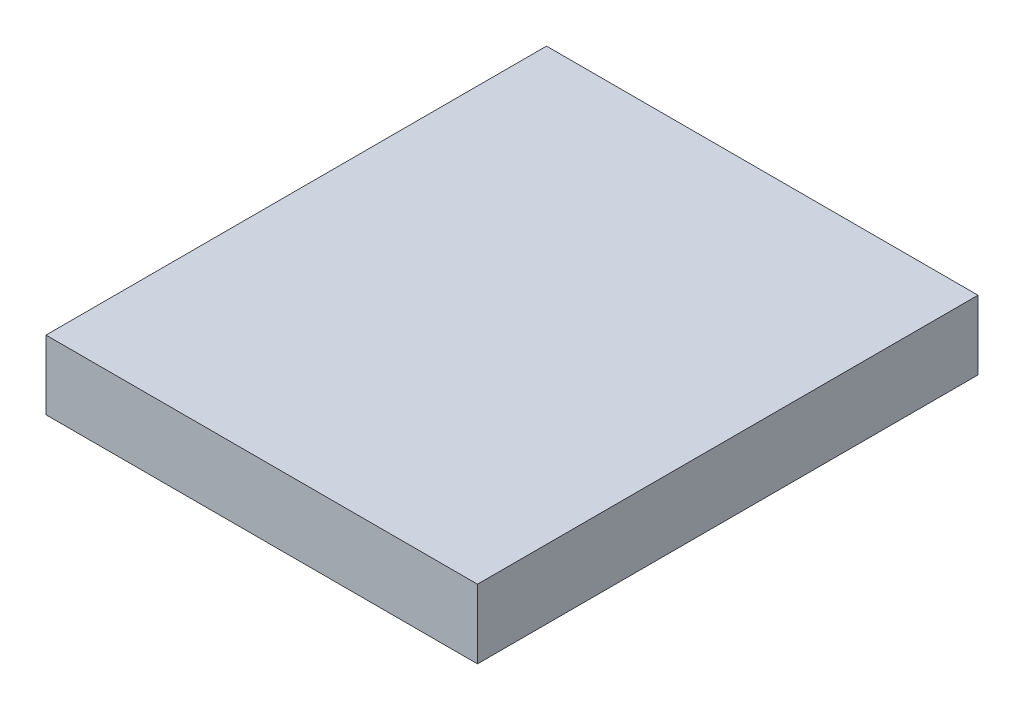
ISO-10303-21;
HEADER;
FILE_DESCRIPTION(('STEP AP214'),'2;1');
FILE_NAME('part.step','',(''),(''),'','','');
FILE_SCHEMA(('AUTOMOTIVE_DESIGN { 1 0 10303 214 1 1 1 1 }'));
ENDSEC;
DATA;
#1=APPLICATION_CONTEXT('core data for automotive mechanical design processes');
#2=APPLICATION_PROTOCOL_DEFINITION('international standard','automotive_design',2000,#1);
#3=PRODUCT_CONTEXT('',#1,'mechanical');
#4=PRODUCT('Part','Part','',(#3));
#5=PRODUCT_RELATED_PRODUCT_CATEGORY('part','',(#4));
#6=PRODUCT_DEFINITION_FORMATION('','',#4);
#7=PRODUCT_DEFINITION_CONTEXT('part definition',#1,'design');
#8=PRODUCT_DEFINITION('design','',#6,#7);
#9=PRODUCT_DEFINITION_SHAPE('','',#8);
#10=(LENGTH_UNIT() NAMED_UNIT(*) SI_UNIT(.MILLI.,.METRE.));
#11=(NAMED_UNIT(*) PLANE_ANGLE_UNIT() SI_UNIT($,.RADIAN.));
#12=(NAMED_UNIT(*) SI_UNIT($,.STERADIAN.) SOLID_ANGLE_UNIT());
#13=UNCERTAINTY_MEASURE_WITH_UNIT(LENGTH_MEASURE(1.E-05),#10,'distance_accuracy_value','');
#14=(GEOMETRIC_REPRESENTATION_CONTEXT(3) GLOBAL_UNCERTAINTY_ASSIGNED_CONTEXT((#13)) GLOBAL_UNIT_ASSIGNED_CONTEXT((#10,
#11,#12)) REPRESENTATION_CONTEXT('',''));
#15=CARTESIAN_POINT('',(0.,0.,0.));
#16=DIRECTION('',(0.,0.,1.));
#17=DIRECTION('',(1.,0.,0.));
#18=AXIS2_PLACEMENT_3D('',#15,#16,#17);
#19=CARTESIAN_POINT('',(0.,-22.86,0.));
#20=DIRECTION('',(0.,-1.,0.));
#21=DIRECTION('',(0.,0.,-1.));
#22=AXIS2_PLACEMENT_3D('',#19,#20,#21);
#23=PLANE('',#22);
#24=DIRECTION('',(0.,0.,-1.));
#25=VECTOR('',#24,1.);
#26=CARTESIAN_POINT('',(79.375,-22.86,-92.075));
#27=LINE('',#26,#25);
#28=CARTESIAN_POINT('',(79.375,-22.86,92.075));
#29=VERTEX_POINT('',#28);
#30=CARTESIAN_POINT('',(79.375,-22.86,-92.075));
#31=VERTEX_POINT('',#30);
#32=EDGE_CURVE('E147',#29,#31,#27,.T.);
#33=ORIENTED_EDGE('',*,*,#32,.F.);
#34=DIRECTION('',(1.,0.,0.));
#35=VECTOR('',#34,1.);
#36=CARTESIAN_POINT('',(79.375,-22.86,92.075));
#37=LINE('',#36,#35);
#38=CARTESIAN_POINT('',(-79.375,-22.86,92.075));
#39=VERTEX_POINT('',#38);
#40=EDGE_CURVE('E155',#39,#29,#37,.T.);
#41=ORIENTED_EDGE('',*,*,#40,.F.);
#42=DIRECTION('',(0.,0.,1.));
#43=VECTOR('',#42,1.);
#44=CARTESIAN_POINT('',(-79.375,-22.86,-92.075));
#45=LINE('',#44,#43);
#46=CARTESIAN_POINT('',(-79.375,-22.86,-92.075));
#47=VERTEX_POINT('',#46);
#48=EDGE_CURVE('E152',#47,#39,#45,.T.);
#49=ORIENTED_EDGE('',*,*,#48,.F.);
#50=DIRECTION('',(-1.,0.,0.));
#51=VECTOR('',#50,1.);
#52=CARTESIAN_POINT('',(79.375,-22.86,-92.075));
#53=LINE('',#52,#51);
#54=EDGE_CURVE('E149',#31,#47,#53,.T.);
#55=ORIENTED_EDGE('',*,*,#54,.F.);
#56=EDGE_LOOP('',(#33,#41,#49,#55));
#57=FACE_BOUND('',#56,.T.);
#58=DIRECTION('',(1.,0.,0.));
#59=VECTOR('',#58,1.);
#60=CARTESIAN_POINT('',(79.375,-22.86,89.535));
#61=LINE('',#60,#59);
#62=CARTESIAN_POINT('',(-76.835,-22.86,89.535));
#63=VERTEX_POINT('',#62);
#64=CARTESIAN_POINT('',(76.835,-22.86,89.535));
#65=VERTEX_POINT('',#64);
#66=EDGE_CURVE('E142',#63,#65,#61,.T.);
#67=ORIENTED_EDGE('',*,*,#66,.T.);
#68=DIRECTION('',(0.,0.,-1.));
#69=VECTOR('',#68,1.);
#70=CARTESIAN_POINT('',(76.835,-22.86,-92.075));
#71=LINE('',#70,#69);
#72=CARTESIAN_POINT('',(76.835,-22.86,-89.535));
#73=VERTEX_POINT('',#72);
#74=EDGE_CURVE('E111',#65,#73,#71,.T.);
#75=ORIENTED_EDGE('',*,*,#74,.T.);
#76=DIRECTION('',(-1.,0.,0.));
#77=VECTOR('',#76,1.);
#78=CARTESIAN_POINT('',(79.375,-22.86,-89.535));
#79=LINE('',#78,#77);
#80=CARTESIAN_POINT('',(-76.835,-22.86,-89.535));
#81=VERTEX_POINT('',#80);
#82=EDGE_CURVE('E132',#73,#81,#79,.T.);
#83=ORIENTED_EDGE('',*,*,#82,.T.);
#84=DIRECTION('',(0.,0.,1.));
#85=VECTOR('',#84,1.);
#86=CARTESIAN_POINT('',(-76.835,-22.86,-92.075));
#87=LINE('',#86,#85);
#88=EDGE_CURVE('E50',#81,#63,#87,.T.);
#89=ORIENTED_EDGE('',*,*,#88,.T.);
#90=EDGE_LOOP('',(#67,#75,#83,#89));
#91=FACE_BOUND('',#90,.T.);
#92=ADVANCED_FACE('F33',(#57,#91),#23,.T.);
#93=CARTESIAN_POINT('',(79.375,-22.86,-92.075));
#94=DIRECTION('',(1.,0.,0.));
#95=DIRECTION('',(0.,0.,-1.));
#96=AXIS2_PLACEMENT_3D('',#93,#94,#95);
#97=PLANE('',#96);
#98=DIRECTION('',(0.,0.,-1.));
#99=VECTOR('',#98,1.);
#100=CARTESIAN_POINT('',(79.375,2.54,-92.075));
#101=LINE('',#100,#99);
#102=CARTESIAN_POINT('',(79.375,2.54,92.075));
#103=VERTEX_POINT('',#102);
#104=CARTESIAN_POINT('',(79.375,2.54,-92.075));
#105=VERTEX_POINT('',#104);
#106=EDGE_CURVE('E116',#103,#105,#101,.T.);
#107=ORIENTED_EDGE('',*,*,#106,.F.);
#108=DIRECTION('',(0.,1.,0.));
#109=VECTOR('',#108,1.);
#110=CARTESIAN_POINT('',(79.375,-22.86,92.075));
#111=LINE('',#110,#109);
#112=EDGE_CURVE('E11',#29,#103,#111,.T.);
#113=ORIENTED_EDGE('',*,*,#112,.F.);
#114=ORIENTED_EDGE('',*,*,#32,.T.);
#115=DIRECTION('',(0.,1.,0.));
#116=VECTOR('',#115,1.);
#117=CARTESIAN_POINT('',(79.375,-22.86,-92.075));
#118=LINE('',#117,#116);
#119=EDGE_CURVE('E37',#31,#105,#118,.T.);
#120=ORIENTED_EDGE('',*,*,#119,.T.);
#121=EDGE_LOOP('',(#107,#113,#114,#120));
#122=FACE_BOUND('',#121,.T.);
#123=ADVANCED_FACE('F35',(#122),#97,.T.);
#124=CARTESIAN_POINT('',(79.375,-22.86,92.075));
#125=DIRECTION('',(0.,0.,1.));
#126=DIRECTION('',(1.,0.,0.));
#127=AXIS2_PLACEMENT_3D('',#124,#125,#126);
#128=PLANE('',#127);
#129=DIRECTION('',(1.,0.,0.));
#130=VECTOR('',#129,1.);
#131=CARTESIAN_POINT('',(79.375,2.54,92.075));
#132=LINE('',#131,#130);
#133=CARTESIAN_POINT('',(-79.375,2.54,92.075));
#134=VERTEX_POINT('',#133);
#135=EDGE_CURVE('E150',#134,#103,#132,.T.);
#136=ORIENTED_EDGE('',*,*,#135,.F.);
#137=DIRECTION('',(0.,1.,0.));
#138=VECTOR('',#137,1.);
#139=CARTESIAN_POINT('',(-79.375,-22.86,92.075));
#140=LINE('',#139,#138);
#141=EDGE_CURVE('E42',#39,#134,#140,.T.);
#142=ORIENTED_EDGE('',*,*,#141,.F.);
#143=ORIENTED_EDGE('',*,*,#40,.T.);
#144=ORIENTED_EDGE('',*,*,#112,.T.);
#145=EDGE_LOOP('',(#136,#142,#143,#144));
#146=FACE_BOUND('',#145,.T.);
#147=ADVANCED_FACE('F172',(#146),#128,.T.);
#148=CARTESIAN_POINT('',(-79.375,-22.86,-92.075));
#149=DIRECTION('',(-1.,0.,0.));
#150=DIRECTION('',(0.,0.,1.));
#151=AXIS2_PLACEMENT_3D('',#148,#149,#150);
#152=PLANE('',#151);
#153=DIRECTION('',(0.,0.,1.));
#154=VECTOR('',#153,1.);
#155=CARTESIAN_POINT('',(-79.375,2.54,-92.075));
#156=LINE('',#155,#154);
#157=CARTESIAN_POINT('',(-79.375,2.54,-92.075));
#158=VERTEX_POINT('',#157);
#159=EDGE_CURVE('E162',#158,#134,#156,.T.);
#160=ORIENTED_EDGE('',*,*,#159,.F.);
#161=DIRECTION('',(0.,1.,0.));
#162=VECTOR('',#161,1.);
#163=CARTESIAN_POINT('',(-79.375,-22.86,-92.075));
#164=LINE('',#163,#162);
#165=EDGE_CURVE('E167',#47,#158,#164,.T.);
#166=ORIENTED_EDGE('',*,*,#165,.F.);
#167=ORIENTED_EDGE('',*,*,#48,.T.);
#168=ORIENTED_EDGE('',*,*,#141,.T.);
#169=EDGE_LOOP('',(#160,#166,#167,#168));
#170=FACE_BOUND('',#169,.T.);
#171=ADVANCED_FACE('F176',(#170),#152,.T.);
#172=CARTESIAN_POINT('',(79.375,-22.86,-92.075));
#173=DIRECTION('',(0.,0.,-1.));
#174=DIRECTION('',(-1.,0.,0.));
#175=AXIS2_PLACEMENT_3D('',#172,#173,#174);
#176=PLANE('',#175);
#177=DIRECTION('',(-1.,0.,0.));
#178=VECTOR('',#177,1.);
#179=CARTESIAN_POINT('',(79.375,2.54,-92.075));
#180=LINE('',#179,#178);
#181=EDGE_CURVE('E159',#105,#158,#180,.T.);
#182=ORIENTED_EDGE('',*,*,#181,.F.);
#183=ORIENTED_EDGE('',*,*,#119,.F.);
#184=ORIENTED_EDGE('',*,*,#54,.T.);
#185=ORIENTED_EDGE('',*,*,#165,.T.);
#186=EDGE_LOOP('',(#182,#183,#184,#185));
#187=FACE_BOUND('',#186,.T.);
#188=ADVANCED_FACE('F169',(#187),#176,.T.);
#189=CARTESIAN_POINT('',(0.,2.54,0.));
#190=DIRECTION('',(0.,-1.,0.));
#191=DIRECTION('',(0.,0.,-1.));
#192=AXIS2_PLACEMENT_3D('',#189,#190,#191);
#193=PLANE('',#192);
#194=ORIENTED_EDGE('',*,*,#106,.T.);
#195=ORIENTED_EDGE('',*,*,#181,.T.);
#196=ORIENTED_EDGE('',*,*,#159,.T.);
#197=ORIENTED_EDGE('',*,*,#135,.T.);
#198=EDGE_LOOP('',(#194,#195,#196,#197));
#199=FACE_BOUND('',#198,.T.);
#200=ADVANCED_FACE('F171',(#199),#193,.F.);
#201=CARTESIAN_POINT('',(76.835,-22.86,-92.075));
#202=DIRECTION('',(1.,0.,0.));
#203=DIRECTION('',(0.,0.,-1.));
#204=AXIS2_PLACEMENT_3D('',#201,#202,#203);
#205=PLANE('',#204);
#206=DIRECTION('',(0.,0.,-1.));
#207=VECTOR('',#206,1.);
#208=CARTESIAN_POINT('',(76.835,0.,-92.075));
#209=LINE('',#208,#207);
#210=CARTESIAN_POINT('',(76.835,0.,89.535));
#211=VERTEX_POINT('',#210);
#212=CARTESIAN_POINT('',(76.835,0.,-89.535));
#213=VERTEX_POINT('',#212);
#214=EDGE_CURVE('E109',#211,#213,#209,.T.);
#215=ORIENTED_EDGE('',*,*,#214,.T.);
#216=DIRECTION('',(0.,1.,0.));
#217=VECTOR('',#216,1.);
#218=CARTESIAN_POINT('',(76.835,-22.86,-89.535));
#219=LINE('',#218,#217);
#220=EDGE_CURVE('E137',#73,#213,#219,.T.);
#221=ORIENTED_EDGE('',*,*,#220,.F.);
#222=ORIENTED_EDGE('',*,*,#74,.F.);
#223=DIRECTION('',(0.,1.,0.));
#224=VECTOR('',#223,1.);
#225=CARTESIAN_POINT('',(76.835,-22.86,89.535));
#226=LINE('',#225,#224);
#227=EDGE_CURVE('E106',#65,#211,#226,.T.);
#228=ORIENTED_EDGE('',*,*,#227,.T.);
#229=EDGE_LOOP('',(#215,#221,#222,#228));
#230=FACE_BOUND('',#229,.T.);
#231=ADVANCED_FACE('F108',(#230),#205,.F.);
#232=CARTESIAN_POINT('',(79.375,-22.86,89.535));
#233=DIRECTION('',(0.,0.,1.));
#234=DIRECTION('',(1.,0.,0.));
#235=AXIS2_PLACEMENT_3D('',#232,#233,#234);
#236=PLANE('',#235);
#237=DIRECTION('',(1.,0.,0.));
#238=VECTOR('',#237,1.);
#239=CARTESIAN_POINT('',(79.375,0.,89.535));
#240=LINE('',#239,#238);
#241=CARTESIAN_POINT('',(-76.835,0.,89.535));
#242=VERTEX_POINT('',#241);
#243=EDGE_CURVE('E124',#242,#211,#240,.T.);
#244=ORIENTED_EDGE('',*,*,#243,.T.);
#245=ORIENTED_EDGE('',*,*,#227,.F.);
#246=ORIENTED_EDGE('',*,*,#66,.F.);
#247=DIRECTION('',(0.,1.,0.));
#248=VECTOR('',#247,1.);
#249=CARTESIAN_POINT('',(-76.835,-22.86,89.535));
#250=LINE('',#249,#248);
#251=EDGE_CURVE('E117',#63,#242,#250,.T.);
#252=ORIENTED_EDGE('',*,*,#251,.T.);
#253=EDGE_LOOP('',(#244,#245,#246,#252));
#254=FACE_BOUND('',#253,.T.);
#255=ADVANCED_FACE('F128',(#254),#236,.F.);
#256=CARTESIAN_POINT('',(-76.835,-22.86,-92.075));
#257=DIRECTION('',(-1.,0.,0.));
#258=DIRECTION('',(0.,0.,1.));
#259=AXIS2_PLACEMENT_3D('',#256,#257,#258);
#260=PLANE('',#259);
#261=DIRECTION('',(0.,0.,1.));
#262=VECTOR('',#261,1.);
#263=CARTESIAN_POINT('',(-76.835,0.,-92.075));
#264=LINE('',#263,#262);
#265=CARTESIAN_POINT('',(-76.835,0.,-89.535));
#266=VERTEX_POINT('',#265);
#267=EDGE_CURVE('E130',#266,#242,#264,.T.);
#268=ORIENTED_EDGE('',*,*,#267,.T.);
#269=ORIENTED_EDGE('',*,*,#251,.F.);
#270=ORIENTED_EDGE('',*,*,#88,.F.);
#271=DIRECTION('',(0.,1.,0.));
#272=VECTOR('',#271,1.);
#273=CARTESIAN_POINT('',(-76.835,-22.86,-89.535));
#274=LINE('',#273,#272);
#275=EDGE_CURVE('E138',#81,#266,#274,.T.);
#276=ORIENTED_EDGE('',*,*,#275,.T.);
#277=EDGE_LOOP('',(#268,#269,#270,#276));
#278=FACE_BOUND('',#277,.T.);
#279=ADVANCED_FACE('F184',(#278),#260,.F.);
#280=CARTESIAN_POINT('',(79.375,-22.86,-89.535));
#281=DIRECTION('',(0.,0.,-1.));
#282=DIRECTION('',(-1.,0.,0.));
#283=AXIS2_PLACEMENT_3D('',#280,#281,#282);
#284=PLANE('',#283);
#285=DIRECTION('',(-1.,0.,0.));
#286=VECTOR('',#285,1.);
#287=CARTESIAN_POINT('',(79.375,0.,-89.535));
#288=LINE('',#287,#286);
#289=EDGE_CURVE('E126',#213,#266,#288,.T.);
#290=ORIENTED_EDGE('',*,*,#289,.T.);
#291=ORIENTED_EDGE('',*,*,#275,.F.);
#292=ORIENTED_EDGE('',*,*,#82,.F.);
#293=ORIENTED_EDGE('',*,*,#220,.T.);
#294=EDGE_LOOP('',(#290,#291,#292,#293));
#295=FACE_BOUND('',#294,.T.);
#296=ADVANCED_FACE('F183',(#295),#284,.F.);
#297=CARTESIAN_POINT('',(0.,0.,0.));
#298=DIRECTION('',(0.,-1.,0.));
#299=DIRECTION('',(0.,0.,-1.));
#300=AXIS2_PLACEMENT_3D('',#297,#298,#299);
#301=PLANE('',#300);
#302=ORIENTED_EDGE('',*,*,#214,.F.);
#303=ORIENTED_EDGE('',*,*,#243,.F.);
#304=ORIENTED_EDGE('',*,*,#267,.F.);
#305=ORIENTED_EDGE('',*,*,#289,.F.);
#306=EDGE_LOOP('',(#302,#303,#304,#305));
#307=FACE_BOUND('',#306,.T.);
#308=ADVANCED_FACE('F122',(#307),#301,.T.);
#309=CLOSED_SHELL('',(#92,#123,#147,#171,#188,#200,#231,#255,#279,#296,#308));
#310=MANIFOLD_SOLID_BREP('B2',#309);
#311=ADVANCED_BREP_SHAPE_REPRESENTATION('',(#18,#310),#14);
#312=SHAPE_DEFINITION_REPRESENTATION(#9,#311);
ENDSEC;
END-ISO-10303-21;
